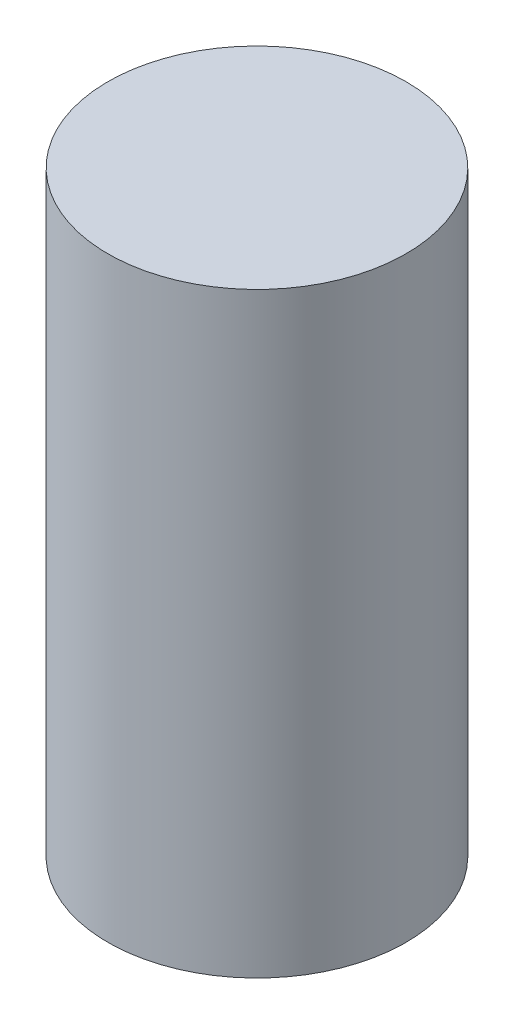
ISO-10303-21;
HEADER;
FILE_DESCRIPTION(('STEP AP214'),'2;1');
FILE_NAME('part.step','',(''),(''),'','','');
FILE_SCHEMA(('AUTOMOTIVE_DESIGN { 1 0 10303 214 1 1 1 1 }'));
ENDSEC;
DATA;
#1=APPLICATION_CONTEXT('core data for automotive mechanical design processes');
#2=APPLICATION_PROTOCOL_DEFINITION('international standard','automotive_design',2000,#1);
#3=PRODUCT_CONTEXT('',#1,'mechanical');
#4=PRODUCT('Part','Part','',(#3));
#5=PRODUCT_RELATED_PRODUCT_CATEGORY('part','',(#4));
#6=PRODUCT_DEFINITION_FORMATION('','',#4);
#7=PRODUCT_DEFINITION_CONTEXT('part definition',#1,'design');
#8=PRODUCT_DEFINITION('design','',#6,#7);
#9=PRODUCT_DEFINITION_SHAPE('','',#8);
#10=(LENGTH_UNIT() NAMED_UNIT(*) SI_UNIT(.MILLI.,.METRE.));
#11=(NAMED_UNIT(*) PLANE_ANGLE_UNIT() SI_UNIT($,.RADIAN.));
#12=(NAMED_UNIT(*) SI_UNIT($,.STERADIAN.) SOLID_ANGLE_UNIT());
#13=UNCERTAINTY_MEASURE_WITH_UNIT(LENGTH_MEASURE(1.E-05),#10,'distance_accuracy_value','');
#14=(GEOMETRIC_REPRESENTATION_CONTEXT(3) GLOBAL_UNCERTAINTY_ASSIGNED_CONTEXT((#13)) GLOBAL_UNIT_ASSIGNED_CONTEXT((#10,
#11,#12)) REPRESENTATION_CONTEXT('',''));
#15=CARTESIAN_POINT('',(0.,0.,0.));
#16=DIRECTION('',(0.,0.,1.));
#17=DIRECTION('',(1.,0.,0.));
#18=AXIS2_PLACEMENT_3D('',#15,#16,#17);
#19=CARTESIAN_POINT('',(0.,19.05,0.));
#20=DIRECTION('',(0.,-1.,0.));
#21=DIRECTION('',(0.,0.,-1.));
#22=AXIS2_PLACEMENT_3D('',#19,#20,#21);
#23=CYLINDRICAL_SURFACE('',#22,4.7625);
#24=CARTESIAN_POINT('',(0.,19.05,0.));
#25=DIRECTION('',(0.,1.,0.));
#26=DIRECTION('',(0.,0.,1.));
#27=AXIS2_PLACEMENT_3D('',#24,#25,#26);
#28=CIRCLE('',#27,4.7625);
#29=CARTESIAN_POINT('',(0.,19.05,-4.7625));
#30=VERTEX_POINT('',#29);
#31=EDGE_CURVE('E10',#30,#30,#28,.T.);
#32=CARTESIAN_POINT('',(0.,0.,0.));
#33=DIRECTION('',(0.,1.,0.));
#34=DIRECTION('',(0.,0.,1.));
#35=AXIS2_PLACEMENT_3D('',#32,#33,#34);
#36=CIRCLE('',#35,4.7625);
#37=CARTESIAN_POINT('',(0.,0.,-4.7625));
#38=VERTEX_POINT('',#37);
#39=EDGE_CURVE('E38',#38,#38,#36,.T.);
#40=CARTESIAN_POINT('',(0.,19.05,-4.7625));
#41=CARTESIAN_POINT('',(0.,18.8515625,-4.7625));
#42=CARTESIAN_POINT('',(0.,18.653125,-4.7625));
#43=CARTESIAN_POINT('',(0.,18.25625,-4.7625));
#44=CARTESIAN_POINT('',(0.,18.0578125,-4.7625));
#45=CARTESIAN_POINT('',(0.,17.6609375,-4.7625));
#46=CARTESIAN_POINT('',(0.,17.4625,-4.7625));
#47=CARTESIAN_POINT('',(0.,17.065625,-4.7625));
#48=CARTESIAN_POINT('',(0.,16.8671875,-4.7625));
#49=CARTESIAN_POINT('',(0.,16.4703125,-4.7625));
#50=CARTESIAN_POINT('',(0.,16.271875,-4.7625));
#51=CARTESIAN_POINT('',(0.,15.875,-4.7625));
#52=CARTESIAN_POINT('',(0.,15.6765625,-4.7625));
#53=CARTESIAN_POINT('',(0.,15.2796875,-4.7625));
#54=CARTESIAN_POINT('',(0.,15.08125,-4.7625));
#55=CARTESIAN_POINT('',(0.,14.684375,-4.7625));
#56=CARTESIAN_POINT('',(0.,14.4859375,-4.7625));
#57=CARTESIAN_POINT('',(0.,14.0890625,-4.7625));
#58=CARTESIAN_POINT('',(0.,13.890625,-4.7625));
#59=CARTESIAN_POINT('',(0.,13.49375,-4.7625));
#60=CARTESIAN_POINT('',(0.,13.2953125,-4.7625));
#61=CARTESIAN_POINT('',(0.,12.8984375,-4.7625));
#62=CARTESIAN_POINT('',(0.,12.7,-4.7625));
#63=CARTESIAN_POINT('',(0.,12.303125,-4.7625));
#64=CARTESIAN_POINT('',(0.,12.1046875,-4.7625));
#65=CARTESIAN_POINT('',(0.,11.7078125,-4.7625));
#66=CARTESIAN_POINT('',(0.,11.509375,-4.7625));
#67=CARTESIAN_POINT('',(0.,11.1125,-4.7625));
#68=CARTESIAN_POINT('',(0.,10.9140625,-4.7625));
#69=CARTESIAN_POINT('',(0.,10.5171875,-4.7625));
#70=CARTESIAN_POINT('',(0.,10.31875,-4.7625));
#71=CARTESIAN_POINT('',(0.,9.921875,-4.7625));
#72=CARTESIAN_POINT('',(0.,9.7234375,-4.7625));
#73=CARTESIAN_POINT('',(0.,9.3265625,-4.7625));
#74=CARTESIAN_POINT('',(0.,9.128125,-4.7625));
#75=CARTESIAN_POINT('',(0.,8.73125,-4.7625));
#76=CARTESIAN_POINT('',(0.,8.5328125,-4.7625));
#77=CARTESIAN_POINT('',(0.,8.1359375,-4.7625));
#78=CARTESIAN_POINT('',(0.,7.9375,-4.7625));
#79=CARTESIAN_POINT('',(0.,7.540625,-4.7625));
#80=CARTESIAN_POINT('',(0.,7.3421875,-4.7625));
#81=CARTESIAN_POINT('',(0.,6.9453125,-4.7625));
#82=CARTESIAN_POINT('',(0.,6.746875,-4.7625));
#83=CARTESIAN_POINT('',(0.,6.35,-4.7625));
#84=CARTESIAN_POINT('',(0.,6.1515625,-4.7625));
#85=CARTESIAN_POINT('',(0.,5.7546875,-4.7625));
#86=CARTESIAN_POINT('',(0.,5.55625,-4.7625));
#87=CARTESIAN_POINT('',(0.,5.159375,-4.7625));
#88=CARTESIAN_POINT('',(0.,4.9609375,-4.7625));
#89=CARTESIAN_POINT('',(0.,4.5640625,-4.7625));
#90=CARTESIAN_POINT('',(0.,4.365625,-4.7625));
#91=CARTESIAN_POINT('',(0.,3.96875,-4.7625));
#92=CARTESIAN_POINT('',(0.,3.7703125,-4.7625));
#93=CARTESIAN_POINT('',(0.,3.3734375,-4.7625));
#94=CARTESIAN_POINT('',(0.,3.175,-4.7625));
#95=CARTESIAN_POINT('',(0.,2.778125,-4.7625));
#96=CARTESIAN_POINT('',(0.,2.5796875,-4.7625));
#97=CARTESIAN_POINT('',(0.,2.1828125,-4.7625));
#98=CARTESIAN_POINT('',(0.,1.984375,-4.7625));
#99=CARTESIAN_POINT('',(0.,1.5875,-4.7625));
#100=CARTESIAN_POINT('',(0.,1.3890625,-4.7625));
#101=CARTESIAN_POINT('',(0.,0.992187500000001,-4.7625));
#102=CARTESIAN_POINT('',(0.,0.793750000000001,-4.7625));
#103=CARTESIAN_POINT('',(0.,0.396875,-4.7625));
#104=CARTESIAN_POINT('',(0.,0.1984375,-4.7625));
#105=CARTESIAN_POINT('',(0.,0.,-4.7625));
#106=B_SPLINE_CURVE_WITH_KNOTS('',3,(#40,#41,#42,#43,#44,#45,#46,#47,#48,#49,#50,#51,#52,#53,
#54,#55,#56,#57,#58,#59,#60,#61,#62,#63,#64,#65,#66,#67,#68,#69,#70,#71,#72,#73,#74,#75,#76,#77,
#78,#79,#80,#81,#82,#83,#84,#85,#86,#87,#88,#89,#90,#91,#92,#93,#94,#95,#96,#97,#98,#99,#100,
#101,#102,#103,#104,#105),.UNSPECIFIED.,.F.,.F.,(4,2,2,2,2,2,2,2,2,2,2,2,2,2,2,2,2,2,2,2,2,2,2,
2,2,2,2,2,2,2,2,2,4),(0.,0.5953125,1.190625,1.7859375,2.38125,2.9765625,3.571875,4.1671875,
4.7625,5.3578125,5.953125,6.5484375,7.14375,7.7390625,8.334375,8.9296875,9.525,10.1203125,
10.715625,11.3109375,11.90625,12.5015625,13.096875,13.6921875,14.2875,14.8828125,15.478125,
16.0734375,16.66875,17.2640625,17.859375,18.4546875,19.05),.UNSPECIFIED.);
#107=EDGE_CURVE('BSEAM35',#30,#38,#106,.T.);
#108=ORIENTED_EDGE('',*,*,#31,.F.);
#109=ORIENTED_EDGE('',*,*,#39,.T.);
#110=ORIENTED_EDGE('',*,*,#107,.T.);
#111=ORIENTED_EDGE('',*,*,#107,.F.);
#112=EDGE_LOOP('',(#108,#110,#109,#111));
#113=FACE_BOUND('',#112,.T.);
#114=ADVANCED_FACE('F35',(#113),#23,.T.);
#115=CARTESIAN_POINT('',(0.,19.05,0.));
#116=DIRECTION('',(0.,1.,0.));
#117=DIRECTION('',(0.,0.,1.));
#118=AXIS2_PLACEMENT_3D('',#115,#116,#117);
#119=PLANE('',#118);
#120=ORIENTED_EDGE('',*,*,#31,.T.);
#121=EDGE_LOOP('',(#120));
#122=FACE_BOUND('',#121,.T.);
#123=ADVANCED_FACE('F50',(#122),#119,.T.);
#124=CARTESIAN_POINT('',(0.,0.,0.));
#125=DIRECTION('',(0.,1.,0.));
#126=DIRECTION('',(0.,0.,1.));
#127=AXIS2_PLACEMENT_3D('',#124,#125,#126);
#128=PLANE('',#127);
#129=ORIENTED_EDGE('',*,*,#39,.F.);
#130=EDGE_LOOP('',(#129));
#131=FACE_BOUND('',#130,.T.);
#132=ADVANCED_FACE('F48',(#131),#128,.F.);
#133=CLOSED_SHELL('',(#114,#123,#132));
#134=MANIFOLD_SOLID_BREP('B2',#133);
#135=ADVANCED_BREP_SHAPE_REPRESENTATION('',(#18,#134),#14);
#136=SHAPE_DEFINITION_REPRESENTATION(#9,#135);
ENDSEC;
END-ISO-10303-21;
